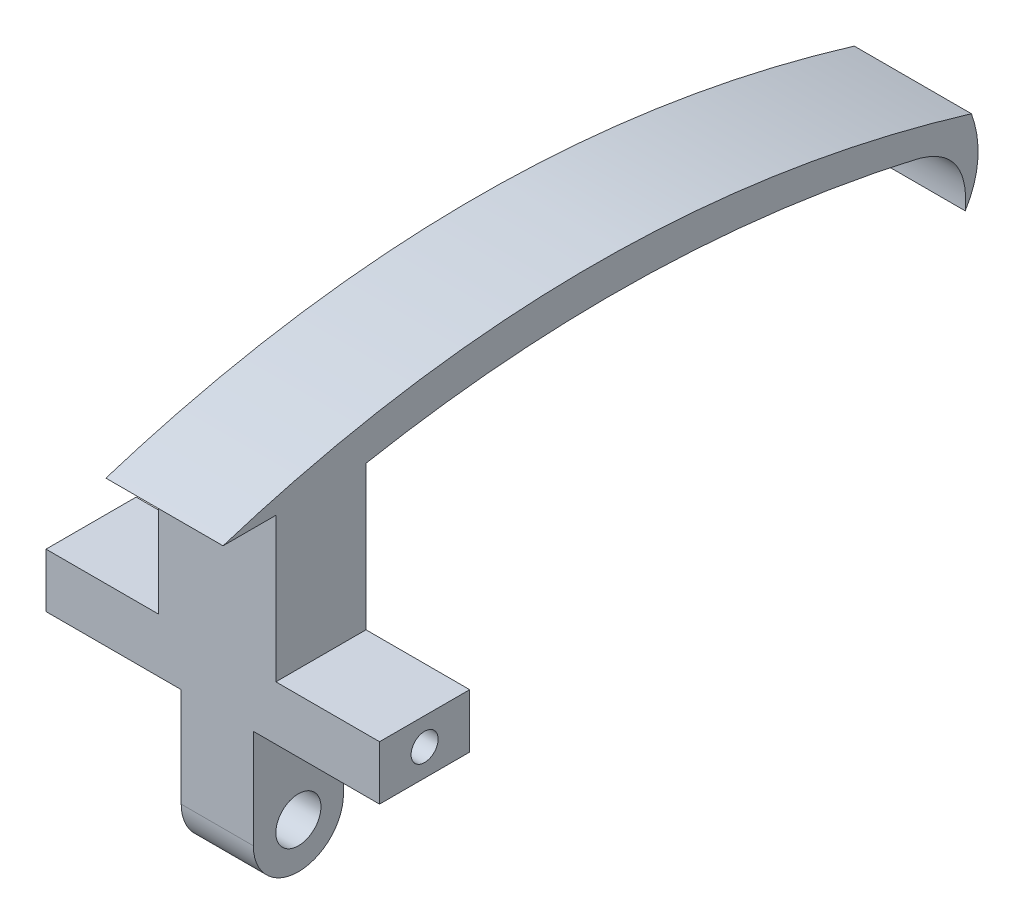
ISO-10303-21;
HEADER;
FILE_DESCRIPTION(('STEP AP214'),'2;1');
FILE_NAME('part.step','',(''),(''),'','','');
FILE_SCHEMA(('AUTOMOTIVE_DESIGN { 1 0 10303 214 1 1 1 1 }'));
ENDSEC;
DATA;
#1=APPLICATION_CONTEXT('core data for automotive mechanical design processes');
#2=APPLICATION_PROTOCOL_DEFINITION('international standard','automotive_design',2000,#1);
#3=PRODUCT_CONTEXT('',#1,'mechanical');
#4=PRODUCT('Part','Part','',(#3));
#5=PRODUCT_RELATED_PRODUCT_CATEGORY('part','',(#4));
#6=PRODUCT_DEFINITION_FORMATION('','',#4);
#7=PRODUCT_DEFINITION_CONTEXT('part definition',#1,'design');
#8=PRODUCT_DEFINITION('design','',#6,#7);
#9=PRODUCT_DEFINITION_SHAPE('','',#8);
#10=(LENGTH_UNIT() NAMED_UNIT(*) SI_UNIT(.MILLI.,.METRE.));
#11=(NAMED_UNIT(*) PLANE_ANGLE_UNIT() SI_UNIT($,.RADIAN.));
#12=(NAMED_UNIT(*) SI_UNIT($,.STERADIAN.) SOLID_ANGLE_UNIT());
#13=UNCERTAINTY_MEASURE_WITH_UNIT(LENGTH_MEASURE(1.E-05),#10,'distance_accuracy_value','');
#14=(GEOMETRIC_REPRESENTATION_CONTEXT(3) GLOBAL_UNCERTAINTY_ASSIGNED_CONTEXT((#13)) GLOBAL_UNIT_ASSIGNED_CONTEXT((#10,
#11,#12)) REPRESENTATION_CONTEXT('',''));
#15=CARTESIAN_POINT('',(0.,0.,0.));
#16=DIRECTION('',(0.,0.,1.));
#17=DIRECTION('',(1.,0.,0.));
#18=AXIS2_PLACEMENT_3D('',#15,#16,#17);
#19=CARTESIAN_POINT('',(57.4999999999999,-52.0060973342833,0.));
#20=DIRECTION('',(0.,0.,1.));
#21=DIRECTION('',(1.,0.,0.));
#22=AXIS2_PLACEMENT_3D('',#19,#20,#21);
#23=PLANE('',#22);
#24=DIRECTION('',(0.,-1.,0.));
#25=VECTOR('',#24,1.);
#26=CARTESIAN_POINT('',(-5.,30.,0.));
#27=LINE('',#26,#25);
#28=CARTESIAN_POINT('',(-5.,30.,0.));
#29=VERTEX_POINT('',#28);
#30=CARTESIAN_POINT('',(-4.99999999999999,0.,0.));
#31=VERTEX_POINT('',#30);
#32=EDGE_CURVE('E57',#29,#31,#27,.T.);
#33=ORIENTED_EDGE('',*,*,#32,.F.);
#34=DIRECTION('',(1.,0.,0.));
#35=VECTOR('',#34,1.);
#36=CARTESIAN_POINT('',(0.,30.,0.));
#37=LINE('',#36,#35);
#38=CARTESIAN_POINT('',(57.4999999999999,30.,0.));
#39=VERTEX_POINT('',#38);
#40=EDGE_CURVE('E171',#29,#39,#37,.T.);
#41=ORIENTED_EDGE('',*,*,#40,.T.);
#42=DIRECTION('',(0.,1.,0.));
#43=VECTOR('',#42,1.);
#44=CARTESIAN_POINT('',(57.4999999999999,-52.0060973342833,0.));
#45=LINE('',#44,#43);
#46=CARTESIAN_POINT('',(57.4999999999999,110.,0.));
#47=VERTEX_POINT('',#46);
#48=EDGE_CURVE('E232',#39,#47,#45,.T.);
#49=ORIENTED_EDGE('',*,*,#48,.T.);
#50=DIRECTION('',(1.,0.,0.));
#51=VECTOR('',#50,1.);
#52=CARTESIAN_POINT('',(-419.562765319842,110.,0.));
#53=LINE('',#52,#51);
#54=CARTESIAN_POINT('',(122.5,110.,0.));
#55=VERTEX_POINT('',#54);
#56=EDGE_CURVE('E288',#47,#55,#53,.T.);
#57=ORIENTED_EDGE('',*,*,#56,.T.);
#58=DIRECTION('',(0.,1.,0.));
#59=VECTOR('',#58,1.);
#60=CARTESIAN_POINT('',(122.5,-52.0060973342833,0.));
#61=LINE('',#60,#59);
#62=CARTESIAN_POINT('',(122.5,30.,0.));
#63=VERTEX_POINT('',#62);
#64=EDGE_CURVE('E234',#63,#55,#61,.T.);
#65=ORIENTED_EDGE('',*,*,#64,.F.);
#66=CARTESIAN_POINT('',(180.,30.,0.));
#67=VERTEX_POINT('',#66);
#68=EDGE_CURVE('E182',#63,#67,#37,.T.);
#69=ORIENTED_EDGE('',*,*,#68,.T.);
#70=DIRECTION('',(0.,-1.,0.));
#71=VECTOR('',#70,1.);
#72=CARTESIAN_POINT('',(180.,30.,0.));
#73=LINE('',#72,#71);
#74=CARTESIAN_POINT('',(180.,0.,0.));
#75=VERTEX_POINT('',#74);
#76=EDGE_CURVE('E181',#67,#75,#73,.T.);
#77=ORIENTED_EDGE('',*,*,#76,.T.);
#78=DIRECTION('',(1.,0.,0.));
#79=VECTOR('',#78,1.);
#80=CARTESIAN_POINT('',(0.,0.,0.));
#81=LINE('',#80,#79);
#82=CARTESIAN_POINT('',(110.,0.,0.));
#83=VERTEX_POINT('',#82);
#84=EDGE_CURVE('E210',#83,#75,#81,.T.);
#85=ORIENTED_EDGE('',*,*,#84,.F.);
#86=DIRECTION('',(0.,1.,0.));
#87=VECTOR('',#86,1.);
#88=CARTESIAN_POINT('',(110.,-80.,0.));
#89=LINE('',#88,#87);
#90=CARTESIAN_POINT('',(110.,-55.,0.));
#91=VERTEX_POINT('',#90);
#92=EDGE_CURVE('E211',#91,#83,#89,.T.);
#93=ORIENTED_EDGE('',*,*,#92,.F.);
#94=DIRECTION('',(1.,0.,0.));
#95=VECTOR('',#94,1.);
#96=CARTESIAN_POINT('',(70.,-55.,0.));
#97=LINE('',#96,#95);
#98=CARTESIAN_POINT('',(70.,-55.,0.));
#99=VERTEX_POINT('',#98);
#100=EDGE_CURVE('E185',#91,#99,#97,.F.);
#101=ORIENTED_EDGE('',*,*,#100,.T.);
#102=DIRECTION('',(0.,1.,0.));
#103=VECTOR('',#102,1.);
#104=CARTESIAN_POINT('',(70.,-80.,0.));
#105=LINE('',#104,#103);
#106=CARTESIAN_POINT('',(70.,0.,0.));
#107=VERTEX_POINT('',#106);
#108=EDGE_CURVE('E208',#99,#107,#105,.T.);
#109=ORIENTED_EDGE('',*,*,#108,.T.);
#110=EDGE_CURVE('E174',#31,#107,#81,.T.);
#111=ORIENTED_EDGE('',*,*,#110,.F.);
#112=EDGE_LOOP('',(#33,#41,#49,#57,#65,#69,#77,#85,#93,#101,#109,#111));
#113=FACE_BOUND('',#112,.T.);
#114=ADVANCED_FACE('F39',(#113),#23,.F.);
#115=CARTESIAN_POINT('',(57.4999999999999,-52.0060973342833,50.));
#116=DIRECTION('',(0.,0.,-1.));
#117=DIRECTION('',(-1.,0.,0.));
#118=AXIS2_PLACEMENT_3D('',#115,#116,#117);
#119=PLANE('',#118);
#120=DIRECTION('',(0.,1.,0.));
#121=VECTOR('',#120,1.);
#122=CARTESIAN_POINT('',(-4.99999999999999,0.,50.));
#123=LINE('',#122,#121);
#124=CARTESIAN_POINT('',(-4.99999999999999,0.,50.));
#125=VERTEX_POINT('',#124);
#126=CARTESIAN_POINT('',(-4.99999999999999,30.,50.));
#127=VERTEX_POINT('',#126);
#128=EDGE_CURVE('E162',#125,#127,#123,.T.);
#129=ORIENTED_EDGE('',*,*,#128,.F.);
#130=DIRECTION('',(1.,0.,0.));
#131=VECTOR('',#130,1.);
#132=CARTESIAN_POINT('',(0.,0.,50.));
#133=LINE('',#132,#131);
#134=CARTESIAN_POINT('',(70.,0.,50.));
#135=VERTEX_POINT('',#134);
#136=EDGE_CURVE('E190',#125,#135,#133,.T.);
#137=ORIENTED_EDGE('',*,*,#136,.T.);
#138=DIRECTION('',(0.,1.,0.));
#139=VECTOR('',#138,1.);
#140=CARTESIAN_POINT('',(70.,-80.,50.));
#141=LINE('',#140,#139);
#142=CARTESIAN_POINT('',(70.,-55.,50.));
#143=VERTEX_POINT('',#142);
#144=EDGE_CURVE('E203',#143,#135,#141,.T.);
#145=ORIENTED_EDGE('',*,*,#144,.F.);
#146=DIRECTION('',(-1.,0.,0.));
#147=VECTOR('',#146,1.);
#148=CARTESIAN_POINT('',(0.,-55.,50.));
#149=LINE('',#148,#147);
#150=CARTESIAN_POINT('',(110.,-55.,50.));
#151=VERTEX_POINT('',#150);
#152=EDGE_CURVE('E202',#143,#151,#149,.F.);
#153=ORIENTED_EDGE('',*,*,#152,.T.);
#154=DIRECTION('',(0.,1.,0.));
#155=VECTOR('',#154,1.);
#156=CARTESIAN_POINT('',(110.,-80.,50.));
#157=LINE('',#156,#155);
#158=CARTESIAN_POINT('',(110.,0.,50.));
#159=VERTEX_POINT('',#158);
#160=EDGE_CURVE('E200',#151,#159,#157,.T.);
#161=ORIENTED_EDGE('',*,*,#160,.T.);
#162=CARTESIAN_POINT('',(180.,0.,50.));
#163=VERTEX_POINT('',#162);
#164=EDGE_CURVE('E187',#159,#163,#133,.T.);
#165=ORIENTED_EDGE('',*,*,#164,.T.);
#166=DIRECTION('',(0.,-1.,0.));
#167=VECTOR('',#166,1.);
#168=CARTESIAN_POINT('',(180.,30.,50.));
#169=LINE('',#168,#167);
#170=CARTESIAN_POINT('',(180.,30.,50.));
#171=VERTEX_POINT('',#170);
#172=EDGE_CURVE('E195',#171,#163,#169,.T.);
#173=ORIENTED_EDGE('',*,*,#172,.F.);
#174=DIRECTION('',(1.,0.,0.));
#175=VECTOR('',#174,1.);
#176=CARTESIAN_POINT('',(0.,30.,50.));
#177=LINE('',#176,#175);
#178=CARTESIAN_POINT('',(122.499999999999,30.,50.));
#179=VERTEX_POINT('',#178);
#180=EDGE_CURVE('E199',#179,#171,#177,.T.);
#181=ORIENTED_EDGE('',*,*,#180,.F.);
#182=DIRECTION('',(0.,1.,0.));
#183=VECTOR('',#182,1.);
#184=CARTESIAN_POINT('',(122.5,-52.0060973342833,50.));
#185=LINE('',#184,#183);
#186=CARTESIAN_POINT('',(122.5,110.,50.));
#187=VERTEX_POINT('',#186);
#188=EDGE_CURVE('E226',#179,#187,#185,.T.);
#189=ORIENTED_EDGE('',*,*,#188,.T.);
#190=DIRECTION('',(-1.,0.,0.));
#191=VECTOR('',#190,1.);
#192=CARTESIAN_POINT('',(57.4999999999999,110.,50.));
#193=LINE('',#192,#191);
#194=CARTESIAN_POINT('',(57.4999999999999,110.,50.));
#195=VERTEX_POINT('',#194);
#196=EDGE_CURVE('E65',#187,#195,#193,.T.);
#197=ORIENTED_EDGE('',*,*,#196,.T.);
#198=DIRECTION('',(0.,1.,0.));
#199=VECTOR('',#198,1.);
#200=CARTESIAN_POINT('',(57.4999999999999,-52.0060973342833,50.));
#201=LINE('',#200,#199);
#202=CARTESIAN_POINT('',(57.4999999999999,30.,50.));
#203=VERTEX_POINT('',#202);
#204=EDGE_CURVE('E224',#203,#195,#201,.T.);
#205=ORIENTED_EDGE('',*,*,#204,.F.);
#206=EDGE_CURVE('E197',#127,#203,#177,.T.);
#207=ORIENTED_EDGE('',*,*,#206,.F.);
#208=EDGE_LOOP('',(#129,#137,#145,#153,#161,#165,#173,#181,#189,#197,#205,#207));
#209=FACE_BOUND('',#208,.T.);
#210=ADVANCED_FACE('F367',(#209),#119,.F.);
#211=CARTESIAN_POINT('',(0.,30.,0.));
#212=DIRECTION('',(0.,-1.,0.));
#213=DIRECTION('',(0.,0.,-1.));
#214=AXIS2_PLACEMENT_3D('',#211,#212,#213);
#215=PLANE('',#214);
#216=DIRECTION('',(0.,0.,-1.));
#217=VECTOR('',#216,1.);
#218=CARTESIAN_POINT('',(-4.99999999999999,30.,50.));
#219=LINE('',#218,#217);
#220=EDGE_CURVE('E159',#127,#29,#219,.T.);
#221=ORIENTED_EDGE('',*,*,#220,.F.);
#222=ORIENTED_EDGE('',*,*,#206,.T.);
#223=DIRECTION('',(0.,0.,-1.));
#224=VECTOR('',#223,1.);
#225=CARTESIAN_POINT('',(57.4999999999999,30.,50.));
#226=LINE('',#225,#224);
#227=EDGE_CURVE('E180',#203,#39,#226,.T.);
#228=ORIENTED_EDGE('',*,*,#227,.T.);
#229=ORIENTED_EDGE('',*,*,#40,.F.);
#230=EDGE_LOOP('',(#221,#222,#228,#229));
#231=FACE_BOUND('',#230,.T.);
#232=ADVANCED_FACE('F178',(#231),#215,.F.);
#233=CARTESIAN_POINT('',(0.,0.,0.));
#234=DIRECTION('',(0.,-1.,0.));
#235=DIRECTION('',(0.,0.,-1.));
#236=AXIS2_PLACEMENT_3D('',#233,#234,#235);
#237=PLANE('',#236);
#238=ORIENTED_EDGE('',*,*,#136,.F.);
#239=DIRECTION('',(0.,0.,1.));
#240=VECTOR('',#239,1.);
#241=CARTESIAN_POINT('',(-5.,0.,0.));
#242=LINE('',#241,#240);
#243=EDGE_CURVE('E175',#31,#125,#242,.T.);
#244=ORIENTED_EDGE('',*,*,#243,.F.);
#245=ORIENTED_EDGE('',*,*,#110,.T.);
#246=DIRECTION('',(0.,0.,-1.));
#247=VECTOR('',#246,1.);
#248=CARTESIAN_POINT('',(70.,0.,0.));
#249=LINE('',#248,#247);
#250=EDGE_CURVE('E206',#135,#107,#249,.T.);
#251=ORIENTED_EDGE('',*,*,#250,.F.);
#252=EDGE_LOOP('',(#238,#244,#245,#251));
#253=FACE_BOUND('',#252,.T.);
#254=ADVANCED_FACE('F329',(#253),#237,.T.);
#255=CARTESIAN_POINT('',(-419.562765319842,110.,0.));
#256=DIRECTION('',(0.,-1.,0.));
#257=DIRECTION('',(0.,0.,-1.));
#258=AXIS2_PLACEMENT_3D('',#255,#256,#257);
#259=PLANE('',#258);
#260=DIRECTION('',(0.,0.,-1.));
#261=VECTOR('',#260,1.);
#262=CARTESIAN_POINT('',(57.4999999999999,110.,0.));
#263=LINE('',#262,#261);
#264=CARTESIAN_POINT('',(57.4999999999999,110.,79.2937214497549));
#265=VERTEX_POINT('',#264);
#266=EDGE_CURVE('E270',#265,#195,#263,.T.);
#267=ORIENTED_EDGE('',*,*,#266,.T.);
#268=ORIENTED_EDGE('',*,*,#196,.F.);
#269=DIRECTION('',(0.,0.,1.));
#270=VECTOR('',#269,1.);
#271=CARTESIAN_POINT('',(122.5,110.,0.));
#272=LINE('',#271,#270);
#273=CARTESIAN_POINT('',(122.5,110.,79.2937214497549));
#274=VERTEX_POINT('',#273);
#275=EDGE_CURVE('E245',#187,#274,#272,.T.);
#276=ORIENTED_EDGE('',*,*,#275,.T.);
#277=DIRECTION('',(1.,0.,0.));
#278=VECTOR('',#277,1.);
#279=CARTESIAN_POINT('',(-419.562765319842,110.,79.2937214497549));
#280=LINE('',#279,#278);
#281=EDGE_CURVE('E295',#265,#274,#280,.T.);
#282=ORIENTED_EDGE('',*,*,#281,.F.);
#283=EDGE_LOOP('',(#267,#268,#276,#282));
#284=FACE_BOUND('',#283,.T.);
#285=ADVANCED_FACE('F325',(#284),#259,.T.);
#286=CARTESIAN_POINT('',(-419.562765319842,110.,-335.808448858543));
#287=CARTESIAN_POINT('',(-419.562765319842,174.375095477853,-123.322725028626));
#288=CARTESIAN_POINT('',(-419.562765319842,110.,79.2937214497549));
#289=B_SPLINE_CURVE_WITH_KNOTS('',2,(#286,#287,#288),.UNSPECIFIED.,.F.,.F.,(3,3),(0.,1.),.UNSPECIFIED.);
#290=DIRECTION('',(1.,0.,0.));
#291=VECTOR('',#290,1.);
#292=SURFACE_OF_LINEAR_EXTRUSION('',#289,#291);
#293=DIRECTION('',(1.,0.,0.));
#294=VECTOR('',#293,1.);
#295=CARTESIAN_POINT('',(-419.562765319842,110.,-335.808448858543));
#296=LINE('',#295,#294);
#297=CARTESIAN_POINT('',(57.4999999999998,110.,-335.808448858543));
#298=VERTEX_POINT('',#297);
#299=CARTESIAN_POINT('',(122.5,110.,-335.808448858543));
#300=VERTEX_POINT('',#299);
#301=EDGE_CURVE('E298',#298,#300,#296,.T.);
#302=ORIENTED_EDGE('',*,*,#301,.F.);
#303=CARTESIAN_POINT('',(57.4999999999998,110.,-335.808448858543));
#304=CARTESIAN_POINT('',(57.4999999999998,174.375095477853,-123.322725028626));
#305=CARTESIAN_POINT('',(57.4999999999998,110.,79.2937214497549));
#306=B_SPLINE_CURVE_WITH_KNOTS('',2,(#303,#304,#305),.UNSPECIFIED.,.F.,.F.,(3,3),(0.,1.),.UNSPECIFIED.);
#307=EDGE_CURVE('E275',#298,#265,#306,.T.);
#308=ORIENTED_EDGE('',*,*,#307,.T.);
#309=ORIENTED_EDGE('',*,*,#281,.T.);
#310=CARTESIAN_POINT('',(122.5,110.,-335.808448858543));
#311=CARTESIAN_POINT('',(122.5,174.375095477853,-123.322725028626));
#312=CARTESIAN_POINT('',(122.5,110.,79.2937214497549));
#313=B_SPLINE_CURVE_WITH_KNOTS('',2,(#310,#311,#312),.UNSPECIFIED.,.F.,.F.,(3,3),(0.,1.),.UNSPECIFIED.);
#314=EDGE_CURVE('E250',#274,#300,#313,.F.);
#315=ORIENTED_EDGE('',*,*,#314,.T.);
#316=EDGE_LOOP('',(#302,#308,#309,#315));
#317=FACE_BOUND('',#316,.T.);
#318=ADVANCED_FACE('F328',(#317),#292,.T.);
#319=CARTESIAN_POINT('',(-419.562765319842,65.0245746761726,-332.386652105914));
#320=CARTESIAN_POINT('',(-419.562765319842,85.0088851188832,-344.65516353102));
#321=CARTESIAN_POINT('',(-419.562765319842,110.,-335.808448858543));
#322=B_SPLINE_CURVE_WITH_KNOTS('',2,(#319,#320,#321),.UNSPECIFIED.,.F.,.F.,(3,3),(0.,1.),.UNSPECIFIED.);
#323=DIRECTION('',(1.,0.,0.));
#324=VECTOR('',#323,1.);
#325=SURFACE_OF_LINEAR_EXTRUSION('',#322,#324);
#326=DIRECTION('',(1.,0.,0.));
#327=VECTOR('',#326,1.);
#328=CARTESIAN_POINT('',(-419.562765319842,65.0245746761726,-332.386652105914));
#329=LINE('',#328,#327);
#330=CARTESIAN_POINT('',(57.4999999999998,65.0245746761726,-332.386652105914));
#331=VERTEX_POINT('',#330);
#332=CARTESIAN_POINT('',(122.5,65.0245746761726,-332.386652105914));
#333=VERTEX_POINT('',#332);
#334=EDGE_CURVE('E287',#331,#333,#329,.T.);
#335=ORIENTED_EDGE('',*,*,#334,.F.);
#336=CARTESIAN_POINT('',(57.4999999999998,65.0245746761726,-332.386652105914));
#337=CARTESIAN_POINT('',(57.4999999999998,85.0088851188832,-344.65516353102));
#338=CARTESIAN_POINT('',(57.4999999999998,110.,-335.808448858543));
#339=B_SPLINE_CURVE_WITH_KNOTS('',2,(#336,#337,#338),.UNSPECIFIED.,.F.,.F.,(3,3),(0.,1.),.UNSPECIFIED.);
#340=EDGE_CURVE('E279',#331,#298,#339,.T.);
#341=ORIENTED_EDGE('',*,*,#340,.T.);
#342=ORIENTED_EDGE('',*,*,#301,.T.);
#343=CARTESIAN_POINT('',(122.5,65.0245746761726,-332.386652105914));
#344=CARTESIAN_POINT('',(122.5,85.0088851188832,-344.65516353102));
#345=CARTESIAN_POINT('',(122.5,110.,-335.808448858543));
#346=B_SPLINE_CURVE_WITH_KNOTS('',2,(#343,#344,#345),.UNSPECIFIED.,.F.,.F.,(3,3),(0.,1.),.UNSPECIFIED.);
#347=EDGE_CURVE('E254',#300,#333,#346,.F.);
#348=ORIENTED_EDGE('',*,*,#347,.T.);
#349=EDGE_LOOP('',(#335,#341,#342,#348));
#350=FACE_BOUND('',#349,.T.);
#351=ADVANCED_FACE('F321',(#350),#325,.T.);
#352=CARTESIAN_POINT('',(-419.562765319842,110.,0.));
#353=CARTESIAN_POINT('',(-419.562765319842,138.708355763765,-153.571097440731));
#354=CARTESIAN_POINT('',(-419.562765319842,102.884741789651,-307.328252939445));
#355=B_SPLINE_CURVE_WITH_KNOTS('',2,(#352,#353,#354),.UNSPECIFIED.,.F.,.F.,(3,3),(0.,1.),.UNSPECIFIED.);
#356=DIRECTION('',(1.,0.,0.));
#357=VECTOR('',#356,1.);
#358=SURFACE_OF_LINEAR_EXTRUSION('',#355,#357);
#359=ORIENTED_EDGE('',*,*,#56,.F.);
#360=CARTESIAN_POINT('',(57.4999999999998,110.,0.));
#361=CARTESIAN_POINT('',(57.4999999999998,138.708355763765,-153.571097440731));
#362=CARTESIAN_POINT('',(57.4999999999998,102.884741789651,-307.328252939445));
#363=B_SPLINE_CURVE_WITH_KNOTS('',2,(#360,#361,#362),.UNSPECIFIED.,.F.,.F.,(3,3),(0.,1.),.UNSPECIFIED.);
#364=CARTESIAN_POINT('',(57.4999999999997,102.884741789651,-307.328252939445));
#365=VERTEX_POINT('',#364);
#366=EDGE_CURVE('E11',#47,#365,#363,.T.);
#367=ORIENTED_EDGE('',*,*,#366,.T.);
#368=DIRECTION('',(1.,0.,0.));
#369=VECTOR('',#368,1.);
#370=CARTESIAN_POINT('',(-419.562765319842,102.884741789651,-307.328252939445));
#371=LINE('',#370,#369);
#372=CARTESIAN_POINT('',(122.5,102.884741789651,-307.328252939445));
#373=VERTEX_POINT('',#372);
#374=EDGE_CURVE('E294',#365,#373,#371,.T.);
#375=ORIENTED_EDGE('',*,*,#374,.T.);
#376=CARTESIAN_POINT('',(122.5,110.,0.));
#377=CARTESIAN_POINT('',(122.5,138.708355763765,-153.571097440731));
#378=CARTESIAN_POINT('',(122.5,102.884741789651,-307.328252939445));
#379=B_SPLINE_CURVE_WITH_KNOTS('',2,(#376,#377,#378),.UNSPECIFIED.,.F.,.F.,(3,3),(0.,1.),.UNSPECIFIED.);
#380=EDGE_CURVE('E50',#373,#55,#379,.F.);
#381=ORIENTED_EDGE('',*,*,#380,.T.);
#382=EDGE_LOOP('',(#359,#367,#375,#381));
#383=FACE_BOUND('',#382,.T.);
#384=ADVANCED_FACE('F317',(#383),#358,.T.);
#385=CARTESIAN_POINT('',(-419.562765319842,102.884741789651,-307.328252939445));
#386=CARTESIAN_POINT('',(-419.562765319842,94.7930743984296,-334.882025134143));
#387=CARTESIAN_POINT('',(-419.562765319842,65.0245746761726,-332.386652105914));
#388=B_SPLINE_CURVE_WITH_KNOTS('',2,(#385,#386,#387),.UNSPECIFIED.,.F.,.F.,(3,3),(0.,1.),.UNSPECIFIED.);
#389=DIRECTION('',(1.,0.,0.));
#390=VECTOR('',#389,1.);
#391=SURFACE_OF_LINEAR_EXTRUSION('',#388,#390);
#392=ORIENTED_EDGE('',*,*,#374,.F.);
#393=CARTESIAN_POINT('',(57.4999999999998,102.884741789651,-307.328252939445));
#394=CARTESIAN_POINT('',(57.4999999999998,94.7930743984296,-334.882025134143));
#395=CARTESIAN_POINT('',(57.4999999999998,65.0245746761726,-332.386652105914));
#396=B_SPLINE_CURVE_WITH_KNOTS('',2,(#393,#394,#395),.UNSPECIFIED.,.F.,.F.,(3,3),(0.,1.),.UNSPECIFIED.);
#397=EDGE_CURVE('E262',#365,#331,#396,.T.);
#398=ORIENTED_EDGE('',*,*,#397,.T.);
#399=ORIENTED_EDGE('',*,*,#334,.T.);
#400=CARTESIAN_POINT('',(122.5,102.884741789651,-307.328252939445));
#401=CARTESIAN_POINT('',(122.5,94.7930743984296,-334.882025134143));
#402=CARTESIAN_POINT('',(122.5,65.0245746761726,-332.386652105914));
#403=B_SPLINE_CURVE_WITH_KNOTS('',2,(#400,#401,#402),.UNSPECIFIED.,.F.,.F.,(3,3),(0.,1.),.UNSPECIFIED.);
#404=EDGE_CURVE('E230',#333,#373,#403,.F.);
#405=ORIENTED_EDGE('',*,*,#404,.T.);
#406=EDGE_LOOP('',(#392,#398,#399,#405));
#407=FACE_BOUND('',#406,.T.);
#408=ADVANCED_FACE('F41',(#407),#391,.T.);
#409=CARTESIAN_POINT('',(122.5,142.187547738927,0.));
#410=DIRECTION('',(1.,0.,0.));
#411=DIRECTION('',(0.,0.,-1.));
#412=AXIS2_PLACEMENT_3D('',#409,#410,#411);
#413=PLANE('',#412);
#414=ORIENTED_EDGE('',*,*,#314,.F.);
#415=ORIENTED_EDGE('',*,*,#275,.F.);
#416=ORIENTED_EDGE('',*,*,#188,.F.);
#417=DIRECTION('',(0.,0.,1.));
#418=VECTOR('',#417,1.);
#419=CARTESIAN_POINT('',(122.5,30.,50.));
#420=LINE('',#419,#418);
#421=EDGE_CURVE('E227',#63,#179,#420,.T.);
#422=ORIENTED_EDGE('',*,*,#421,.F.);
#423=ORIENTED_EDGE('',*,*,#64,.T.);
#424=ORIENTED_EDGE('',*,*,#380,.F.);
#425=ORIENTED_EDGE('',*,*,#404,.F.);
#426=ORIENTED_EDGE('',*,*,#347,.F.);
#427=EDGE_LOOP('',(#414,#415,#416,#422,#423,#424,#425,#426));
#428=FACE_BOUND('',#427,.T.);
#429=ADVANCED_FACE('F323',(#428),#413,.T.);
#430=CARTESIAN_POINT('',(57.4999999999999,142.187547738927,0.));
#431=DIRECTION('',(-1.,0.,0.));
#432=DIRECTION('',(0.,0.,1.));
#433=AXIS2_PLACEMENT_3D('',#430,#431,#432);
#434=PLANE('',#433);
#435=ORIENTED_EDGE('',*,*,#397,.F.);
#436=ORIENTED_EDGE('',*,*,#366,.F.);
#437=ORIENTED_EDGE('',*,*,#48,.F.);
#438=ORIENTED_EDGE('',*,*,#227,.F.);
#439=ORIENTED_EDGE('',*,*,#204,.T.);
#440=ORIENTED_EDGE('',*,*,#266,.F.);
#441=ORIENTED_EDGE('',*,*,#307,.F.);
#442=ORIENTED_EDGE('',*,*,#340,.F.);
#443=EDGE_LOOP('',(#435,#436,#437,#438,#439,#440,#441,#442));
#444=FACE_BOUND('',#443,.T.);
#445=ADVANCED_FACE('F358',(#444),#434,.T.);
#446=ORIENTED_EDGE('',*,*,#68,.F.);
#447=ORIENTED_EDGE('',*,*,#421,.T.);
#448=ORIENTED_EDGE('',*,*,#180,.T.);
#449=DIRECTION('',(0.,0.,1.));
#450=VECTOR('',#449,1.);
#451=CARTESIAN_POINT('',(180.,30.,0.));
#452=LINE('',#451,#450);
#453=EDGE_CURVE('E192',#67,#171,#452,.T.);
#454=ORIENTED_EDGE('',*,*,#453,.F.);
#455=EDGE_LOOP('',(#446,#447,#448,#454));
#456=FACE_BOUND('',#455,.T.);
#457=ADVANCED_FACE('F401',(#456),#215,.F.);
#458=DIRECTION('',(0.,0.,1.));
#459=VECTOR('',#458,1.);
#460=CARTESIAN_POINT('',(110.,0.,0.));
#461=LINE('',#460,#459);
#462=EDGE_CURVE('E213',#83,#159,#461,.T.);
#463=ORIENTED_EDGE('',*,*,#462,.F.);
#464=ORIENTED_EDGE('',*,*,#84,.T.);
#465=DIRECTION('',(0.,0.,1.));
#466=VECTOR('',#465,1.);
#467=CARTESIAN_POINT('',(180.,0.,0.));
#468=LINE('',#467,#466);
#469=EDGE_CURVE('E196',#75,#163,#468,.T.);
#470=ORIENTED_EDGE('',*,*,#469,.T.);
#471=ORIENTED_EDGE('',*,*,#164,.F.);
#472=EDGE_LOOP('',(#463,#464,#470,#471));
#473=FACE_BOUND('',#472,.T.);
#474=ADVANCED_FACE('F396',(#473),#237,.T.);
#475=CARTESIAN_POINT('',(180.,30.,0.));
#476=DIRECTION('',(1.,0.,0.));
#477=DIRECTION('',(0.,0.,-1.));
#478=AXIS2_PLACEMENT_3D('',#475,#476,#477);
#479=PLANE('',#478);
#480=CARTESIAN_POINT('',(180.,15.,25.));
#481=DIRECTION('',(-1.,0.,0.));
#482=DIRECTION('',(0.,0.,1.));
#483=AXIS2_PLACEMENT_3D('',#480,#481,#482);
#484=CIRCLE('',#483,7.5);
#485=CARTESIAN_POINT('',(180.,15.,32.5));
#486=VERTEX_POINT('',#485);
#487=EDGE_CURVE('E166',#486,#486,#484,.T.);
#488=ORIENTED_EDGE('',*,*,#487,.T.);
#489=EDGE_LOOP('',(#488));
#490=FACE_BOUND('',#489,.T.);
#491=ORIENTED_EDGE('',*,*,#469,.F.);
#492=ORIENTED_EDGE('',*,*,#76,.F.);
#493=ORIENTED_EDGE('',*,*,#453,.T.);
#494=ORIENTED_EDGE('',*,*,#172,.T.);
#495=EDGE_LOOP('',(#491,#492,#493,#494));
#496=FACE_BOUND('',#495,.T.);
#497=ADVANCED_FACE('F400',(#490,#496),#479,.T.);
#498=CARTESIAN_POINT('',(110.,-80.,0.));
#499=DIRECTION('',(-1.,0.,0.));
#500=DIRECTION('',(0.,0.,1.));
#501=AXIS2_PLACEMENT_3D('',#498,#499,#500);
#502=PLANE('',#501);
#503=CARTESIAN_POINT('',(110.,-55.,25.));
#504=DIRECTION('',(1.,0.,0.));
#505=DIRECTION('',(0.,0.,-1.));
#506=AXIS2_PLACEMENT_3D('',#503,#504,#505);
#507=CIRCLE('',#506,12.5);
#508=CARTESIAN_POINT('',(110.,-55.,12.5));
#509=VERTEX_POINT('',#508);
#510=EDGE_CURVE('E221',#509,#509,#507,.T.);
#511=ORIENTED_EDGE('',*,*,#510,.F.);
#512=EDGE_LOOP('',(#511));
#513=FACE_BOUND('',#512,.T.);
#514=ORIENTED_EDGE('',*,*,#160,.F.);
#515=CARTESIAN_POINT('',(110.,-55.,25.));
#516=DIRECTION('',(-1.,0.,0.));
#517=DIRECTION('',(0.,0.,1.));
#518=AXIS2_PLACEMENT_3D('',#515,#516,#517);
#519=CIRCLE('',#518,25.);
#520=CARTESIAN_POINT('',(110.,-80.,25.));
#521=VERTEX_POINT('',#520);
#522=EDGE_CURVE('E382',#151,#521,#519,.F.);
#523=ORIENTED_EDGE('',*,*,#522,.T.);
#524=CARTESIAN_POINT('',(110.,-55.,25.));
#525=DIRECTION('',(-1.,0.,0.));
#526=DIRECTION('',(0.,0.,1.));
#527=AXIS2_PLACEMENT_3D('',#524,#525,#526);
#528=CIRCLE('',#527,25.);
#529=EDGE_CURVE('E214',#521,#91,#528,.F.);
#530=ORIENTED_EDGE('',*,*,#529,.T.);
#531=ORIENTED_EDGE('',*,*,#92,.T.);
#532=ORIENTED_EDGE('',*,*,#462,.T.);
#533=EDGE_LOOP('',(#514,#523,#530,#531,#532));
#534=FACE_BOUND('',#533,.T.);
#535=ADVANCED_FACE('F426',(#513,#534),#502,.F.);
#536=CARTESIAN_POINT('',(70.,-80.,0.));
#537=DIRECTION('',(1.,0.,0.));
#538=DIRECTION('',(0.,0.,-1.));
#539=AXIS2_PLACEMENT_3D('',#536,#537,#538);
#540=PLANE('',#539);
#541=CARTESIAN_POINT('',(70.,-55.,25.));
#542=DIRECTION('',(1.,0.,0.));
#543=DIRECTION('',(0.,0.,-1.));
#544=AXIS2_PLACEMENT_3D('',#541,#542,#543);
#545=CIRCLE('',#544,12.5);
#546=CARTESIAN_POINT('',(70.,-55.,12.5));
#547=VERTEX_POINT('',#546);
#548=EDGE_CURVE('E220',#547,#547,#545,.T.);
#549=ORIENTED_EDGE('',*,*,#548,.T.);
#550=EDGE_LOOP('',(#549));
#551=FACE_BOUND('',#550,.T.);
#552=CARTESIAN_POINT('',(70.,-55.,25.));
#553=DIRECTION('',(1.,0.,0.));
#554=DIRECTION('',(0.,0.,-1.));
#555=AXIS2_PLACEMENT_3D('',#552,#553,#554);
#556=CIRCLE('',#555,25.);
#557=CARTESIAN_POINT('',(70.,-80.,25.));
#558=VERTEX_POINT('',#557);
#559=EDGE_CURVE('E378',#99,#558,#556,.F.);
#560=ORIENTED_EDGE('',*,*,#559,.T.);
#561=CARTESIAN_POINT('',(70.,-55.,25.));
#562=DIRECTION('',(1.,0.,0.));
#563=DIRECTION('',(0.,0.,-1.));
#564=AXIS2_PLACEMENT_3D('',#561,#562,#563);
#565=CIRCLE('',#564,25.);
#566=EDGE_CURVE('E207',#558,#143,#565,.F.);
#567=ORIENTED_EDGE('',*,*,#566,.T.);
#568=ORIENTED_EDGE('',*,*,#144,.T.);
#569=ORIENTED_EDGE('',*,*,#250,.T.);
#570=ORIENTED_EDGE('',*,*,#108,.F.);
#571=EDGE_LOOP('',(#560,#567,#568,#569,#570));
#572=FACE_BOUND('',#571,.T.);
#573=ADVANCED_FACE('F423',(#551,#572),#540,.F.);
#574=CARTESIAN_POINT('',(0.,-55.,25.));
#575=DIRECTION('',(-1.,0.,0.));
#576=DIRECTION('',(0.,0.,1.));
#577=AXIS2_PLACEMENT_3D('',#574,#575,#576);
#578=CYLINDRICAL_SURFACE('',#577,25.);
#579=ORIENTED_EDGE('',*,*,#100,.F.);
#580=ORIENTED_EDGE('',*,*,#529,.F.);
#581=DIRECTION('',(1.,0.,0.));
#582=VECTOR('',#581,1.);
#583=CARTESIAN_POINT('',(110.,-80.,25.));
#584=LINE('',#583,#582);
#585=EDGE_CURVE('E217',#558,#521,#584,.T.);
#586=ORIENTED_EDGE('',*,*,#585,.F.);
#587=ORIENTED_EDGE('',*,*,#559,.F.);
#588=EDGE_LOOP('',(#579,#580,#586,#587));
#589=FACE_BOUND('',#588,.T.);
#590=ADVANCED_FACE('F425',(#589),#578,.T.);
#591=CARTESIAN_POINT('',(0.,-55.,25.));
#592=DIRECTION('',(-1.,0.,0.));
#593=DIRECTION('',(0.,0.,1.));
#594=AXIS2_PLACEMENT_3D('',#591,#592,#593);
#595=CYLINDRICAL_SURFACE('',#594,25.);
#596=ORIENTED_EDGE('',*,*,#522,.F.);
#597=ORIENTED_EDGE('',*,*,#152,.F.);
#598=ORIENTED_EDGE('',*,*,#566,.F.);
#599=ORIENTED_EDGE('',*,*,#585,.T.);
#600=EDGE_LOOP('',(#596,#597,#598,#599));
#601=FACE_BOUND('',#600,.T.);
#602=ADVANCED_FACE('F421',(#601),#595,.T.);
#603=CARTESIAN_POINT('',(0.,-55.,25.0000000000001));
#604=DIRECTION('',(1.,0.,0.));
#605=DIRECTION('',(0.,0.,-1.));
#606=AXIS2_PLACEMENT_3D('',#603,#604,#605);
#607=CYLINDRICAL_SURFACE('',#606,12.5);
#608=ORIENTED_EDGE('',*,*,#510,.T.);
#609=EDGE_LOOP('',(#608));
#610=FACE_BOUND('',#609,.T.);
#611=ORIENTED_EDGE('',*,*,#548,.F.);
#612=EDGE_LOOP('',(#611));
#613=FACE_BOUND('',#612,.T.);
#614=ADVANCED_FACE('F419',(#610,#613),#607,.F.);
#615=CARTESIAN_POINT('',(-5.,0.,0.));
#616=DIRECTION('',(-1.,0.,0.));
#617=DIRECTION('',(0.,0.,1.));
#618=AXIS2_PLACEMENT_3D('',#615,#616,#617);
#619=PLANE('',#618);
#620=CARTESIAN_POINT('',(-5.,15.,25.));
#621=DIRECTION('',(-1.,0.,0.));
#622=DIRECTION('',(0.,0.,1.));
#623=AXIS2_PLACEMENT_3D('',#620,#621,#622);
#624=CIRCLE('',#623,7.5);
#625=CARTESIAN_POINT('',(-4.99999999999998,15.,32.5));
#626=VERTEX_POINT('',#625);
#627=EDGE_CURVE('E639',#626,#626,#624,.T.);
#628=ORIENTED_EDGE('',*,*,#627,.F.);
#629=EDGE_LOOP('',(#628));
#630=FACE_BOUND('',#629,.T.);
#631=ORIENTED_EDGE('',*,*,#220,.T.);
#632=ORIENTED_EDGE('',*,*,#32,.T.);
#633=ORIENTED_EDGE('',*,*,#243,.T.);
#634=ORIENTED_EDGE('',*,*,#128,.T.);
#635=EDGE_LOOP('',(#631,#632,#633,#634));
#636=FACE_BOUND('',#635,.T.);
#637=ADVANCED_FACE('F160',(#630,#636),#619,.T.);
#638=CARTESIAN_POINT('',(180.,15.,25.));
#639=DIRECTION('',(-1.,0.,0.));
#640=DIRECTION('',(0.,0.,1.));
#641=AXIS2_PLACEMENT_3D('',#638,#639,#640);
#642=CYLINDRICAL_SURFACE('',#641,7.5);
#643=CARTESIAN_POINT('',(180.,15.,32.5));
#644=CARTESIAN_POINT('',(178.072916666667,15.,32.5));
#645=CARTESIAN_POINT('',(176.145833333333,15.,32.5));
#646=CARTESIAN_POINT('',(172.291666666667,15.,32.5));
#647=CARTESIAN_POINT('',(170.364583333333,15.,32.5));
#648=CARTESIAN_POINT('',(166.510416666667,15.,32.5));
#649=CARTESIAN_POINT('',(164.583333333333,15.,32.5));
#650=CARTESIAN_POINT('',(160.729166666667,15.,32.5));
#651=CARTESIAN_POINT('',(158.802083333333,15.,32.5));
#652=CARTESIAN_POINT('',(154.947916666667,15.,32.5));
#653=CARTESIAN_POINT('',(153.020833333333,15.,32.5));
#654=CARTESIAN_POINT('',(149.166666666667,15.,32.5));
#655=CARTESIAN_POINT('',(147.239583333333,15.,32.5));
#656=CARTESIAN_POINT('',(143.385416666667,15.,32.5));
#657=CARTESIAN_POINT('',(141.458333333333,15.,32.5));
#658=CARTESIAN_POINT('',(137.604166666667,15.,32.5));
#659=CARTESIAN_POINT('',(135.677083333333,15.,32.5));
#660=CARTESIAN_POINT('',(131.822916666667,15.,32.5));
#661=CARTESIAN_POINT('',(129.895833333333,15.,32.5));
#662=CARTESIAN_POINT('',(126.041666666667,15.,32.5));
#663=CARTESIAN_POINT('',(124.114583333333,15.,32.5));
#664=CARTESIAN_POINT('',(120.260416666667,15.,32.5));
#665=CARTESIAN_POINT('',(118.333333333333,15.,32.5));
#666=CARTESIAN_POINT('',(114.479166666667,15.,32.5));
#667=CARTESIAN_POINT('',(112.552083333333,15.,32.5));
#668=CARTESIAN_POINT('',(108.697916666667,15.,32.5));
#669=CARTESIAN_POINT('',(106.770833333333,15.,32.5));
#670=CARTESIAN_POINT('',(102.916666666667,15.,32.5));
#671=CARTESIAN_POINT('',(100.989583333333,15.,32.5));
#672=CARTESIAN_POINT('',(97.1354166666667,15.,32.5));
#673=CARTESIAN_POINT('',(95.2083333333334,15.,32.5));
#674=CARTESIAN_POINT('',(91.3541666666667,15.,32.5));
#675=CARTESIAN_POINT('',(89.4270833333334,15.,32.5));
#676=CARTESIAN_POINT('',(85.5729166666667,15.,32.5));
#677=CARTESIAN_POINT('',(83.6458333333334,15.,32.5));
#678=CARTESIAN_POINT('',(79.7916666666667,15.,32.5));
#679=CARTESIAN_POINT('',(77.8645833333334,15.,32.5));
#680=CARTESIAN_POINT('',(74.0104166666667,15.,32.5));
#681=CARTESIAN_POINT('',(72.0833333333334,15.,32.5));
#682=CARTESIAN_POINT('',(68.2291666666667,15.,32.5));
#683=CARTESIAN_POINT('',(66.3020833333334,15.,32.5));
#684=CARTESIAN_POINT('',(62.4479166666667,15.,32.5));
#685=CARTESIAN_POINT('',(60.5208333333334,15.,32.5));
#686=CARTESIAN_POINT('',(56.6666666666667,15.,32.5));
#687=CARTESIAN_POINT('',(54.7395833333334,15.,32.5));
#688=CARTESIAN_POINT('',(50.8854166666667,15.,32.5));
#689=CARTESIAN_POINT('',(48.9583333333334,15.,32.5));
#690=CARTESIAN_POINT('',(45.1041666666667,15.,32.5));
#691=CARTESIAN_POINT('',(43.1770833333334,15.,32.5));
#692=CARTESIAN_POINT('',(39.3229166666667,15.,32.5));
#693=CARTESIAN_POINT('',(37.3958333333334,15.,32.5));
#694=CARTESIAN_POINT('',(33.5416666666667,15.,32.5));
#695=CARTESIAN_POINT('',(31.6145833333334,15.,32.5));
#696=CARTESIAN_POINT('',(27.7604166666667,15.,32.5));
#697=CARTESIAN_POINT('',(25.8333333333334,15.,32.5));
#698=CARTESIAN_POINT('',(21.9791666666667,15.,32.5));
#699=CARTESIAN_POINT('',(20.0520833333334,15.,32.5));
#700=CARTESIAN_POINT('',(16.1979166666667,15.,32.5));
#701=CARTESIAN_POINT('',(14.2708333333334,15.,32.5));
#702=CARTESIAN_POINT('',(10.4166666666667,15.,32.5));
#703=CARTESIAN_POINT('',(8.48958333333336,15.,32.5));
#704=CARTESIAN_POINT('',(4.6354166666667,15.,32.5));
#705=CARTESIAN_POINT('',(2.70833333333337,15.,32.5));
#706=CARTESIAN_POINT('',(-1.1458333333333,15.,32.5));
#707=CARTESIAN_POINT('',(-3.07291666666664,15.,32.5));
#708=CARTESIAN_POINT('',(-4.99999999999998,15.,32.5));
#709=B_SPLINE_CURVE_WITH_KNOTS('',3,(#643,#644,#645,#646,#647,#648,#649,#650,#651,#652,#653,
#654,#655,#656,#657,#658,#659,#660,#661,#662,#663,#664,#665,#666,#667,#668,#669,#670,#671,#672,
#673,#674,#675,#676,#677,#678,#679,#680,#681,#682,#683,#684,#685,#686,#687,#688,#689,#690,#691,
#692,#693,#694,#695,#696,#697,#698,#699,#700,#701,#702,#703,#704,#705,#706,#707,#708),
.UNSPECIFIED.,.F.,.F.,(4,2,2,2,2,2,2,2,2,2,2,2,2,2,2,2,2,2,2,2,2,2,2,2,2,2,2,2,2,2,2,2,4),(0.,
5.78125000000002,11.5625,17.34375,23.125,28.90625,34.6875,40.46875,46.25,52.03125,57.8125,
63.59375,69.375,75.15625,80.9375,86.71875,92.5,98.28125,104.0625,109.84375,115.625,121.40625,
127.1875,132.96875,138.75,144.53125,150.3125,156.09375,161.875,167.65625,173.4375,179.21875,
185.),.UNSPECIFIED.);
#710=EDGE_CURVE('BSEAM476',#486,#626,#709,.T.);
#711=ORIENTED_EDGE('',*,*,#487,.F.);
#712=ORIENTED_EDGE('',*,*,#627,.T.);
#713=ORIENTED_EDGE('',*,*,#710,.T.);
#714=ORIENTED_EDGE('',*,*,#710,.F.);
#715=EDGE_LOOP('',(#711,#713,#712,#714));
#716=FACE_BOUND('',#715,.T.);
#717=ADVANCED_FACE('F476',(#716),#642,.F.);
#718=CLOSED_SHELL('',(#114,#210,#232,#254,#285,#318,#351,#384,#408,#429,#445,#457,#474,#497,
#535,#573,#590,#602,#614,#637,#717));
#719=MANIFOLD_SOLID_BREP('B2',#718);
#720=ADVANCED_BREP_SHAPE_REPRESENTATION('',(#18,#719),#14);
#721=SHAPE_DEFINITION_REPRESENTATION(#9,#720);
ENDSEC;
END-ISO-10303-21;
